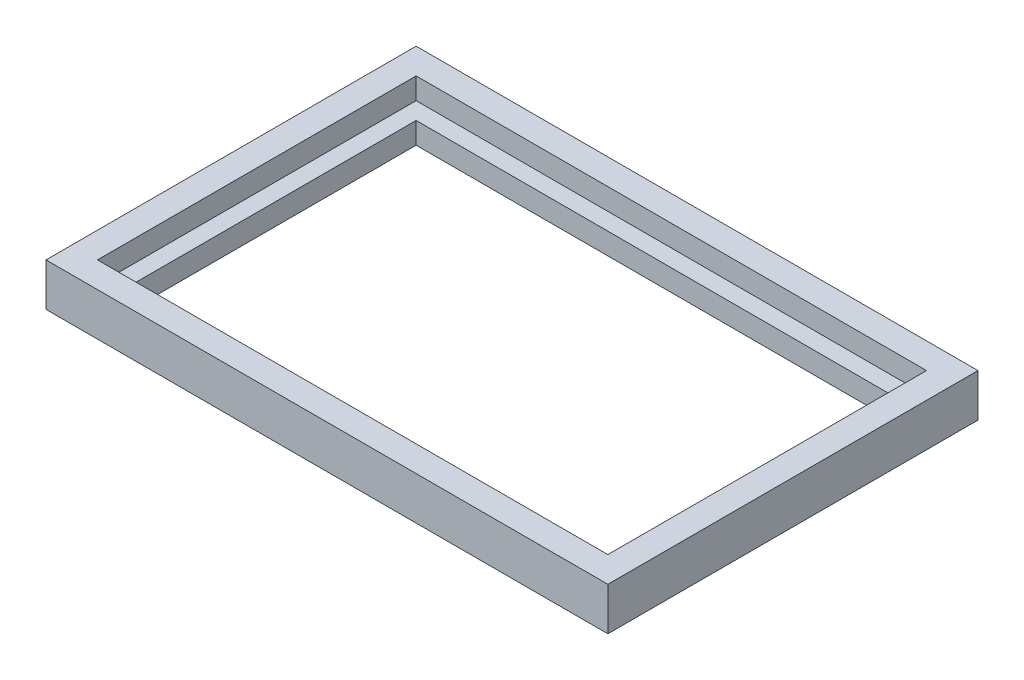
ISO-10303-21;
HEADER;
FILE_DESCRIPTION(('STEP AP214'),'2;1');
FILE_NAME('part.step','',(''),(''),'','','');
FILE_SCHEMA(('AUTOMOTIVE_DESIGN { 1 0 10303 214 1 1 1 1 }'));
ENDSEC;
DATA;
#1=APPLICATION_CONTEXT('core data for automotive mechanical design processes');
#2=APPLICATION_PROTOCOL_DEFINITION('international standard','automotive_design',2000,#1);
#3=PRODUCT_CONTEXT('',#1,'mechanical');
#4=PRODUCT('Part','Part','',(#3));
#5=PRODUCT_RELATED_PRODUCT_CATEGORY('part','',(#4));
#6=PRODUCT_DEFINITION_FORMATION('','',#4);
#7=PRODUCT_DEFINITION_CONTEXT('part definition',#1,'design');
#8=PRODUCT_DEFINITION('design','',#6,#7);
#9=PRODUCT_DEFINITION_SHAPE('','',#8);
#10=(LENGTH_UNIT() NAMED_UNIT(*) SI_UNIT(.MILLI.,.METRE.));
#11=(NAMED_UNIT(*) PLANE_ANGLE_UNIT() SI_UNIT($,.RADIAN.));
#12=(NAMED_UNIT(*) SI_UNIT($,.STERADIAN.) SOLID_ANGLE_UNIT());
#13=UNCERTAINTY_MEASURE_WITH_UNIT(LENGTH_MEASURE(1.E-05),#10,'distance_accuracy_value','');
#14=(GEOMETRIC_REPRESENTATION_CONTEXT(3) GLOBAL_UNCERTAINTY_ASSIGNED_CONTEXT((#13)) GLOBAL_UNIT_ASSIGNED_CONTEXT((#10,
#11,#12)) REPRESENTATION_CONTEXT('',''));
#15=CARTESIAN_POINT('',(0.,0.,0.));
#16=DIRECTION('',(0.,0.,1.));
#17=DIRECTION('',(1.,0.,0.));
#18=AXIS2_PLACEMENT_3D('',#15,#16,#17);
#19=CARTESIAN_POINT('',(-23.2906654675505,2.5,47.135438217786));
#20=DIRECTION('',(0.,0.,1.));
#21=DIRECTION('',(1.,0.,0.));
#22=AXIS2_PLACEMENT_3D('',#19,#20,#21);
#23=PLANE('',#22);
#24=DIRECTION('',(1.,0.,0.));
#25=VECTOR('',#24,1.);
#26=CARTESIAN_POINT('',(-23.2906654675505,5.,47.135438217786));
#27=LINE('',#26,#25);
#28=CARTESIAN_POINT('',(-23.2906654675506,5.,47.135438217786));
#29=VERTEX_POINT('',#28);
#30=CARTESIAN_POINT('',(36.2093345324495,5.,47.135438217786));
#31=VERTEX_POINT('',#30);
#32=EDGE_CURVE('E184',#29,#31,#27,.T.);
#33=ORIENTED_EDGE('',*,*,#32,.T.);
#34=DIRECTION('',(0.,1.,0.));
#35=VECTOR('',#34,1.);
#36=CARTESIAN_POINT('',(36.2093345324495,2.5,47.135438217786));
#37=LINE('',#36,#35);
#38=CARTESIAN_POINT('',(36.2093345324495,2.5,47.135438217786));
#39=VERTEX_POINT('',#38);
#40=EDGE_CURVE('E193',#39,#31,#37,.T.);
#41=ORIENTED_EDGE('',*,*,#40,.F.);
#42=DIRECTION('',(1.,0.,0.));
#43=VECTOR('',#42,1.);
#44=CARTESIAN_POINT('',(-23.2906654675505,2.5,47.135438217786));
#45=LINE('',#44,#43);
#46=CARTESIAN_POINT('',(-23.2906654675505,2.5,47.135438217786));
#47=VERTEX_POINT('',#46);
#48=EDGE_CURVE('E159',#47,#39,#45,.T.);
#49=ORIENTED_EDGE('',*,*,#48,.F.);
#50=DIRECTION('',(0.,1.,0.));
#51=VECTOR('',#50,1.);
#52=CARTESIAN_POINT('',(-23.2906654675505,2.5,47.135438217786));
#53=LINE('',#52,#51);
#54=EDGE_CURVE('E188',#47,#29,#53,.T.);
#55=ORIENTED_EDGE('',*,*,#54,.T.);
#56=EDGE_LOOP('',(#33,#41,#49,#55));
#57=FACE_BOUND('',#56,.T.);
#58=ADVANCED_FACE('F41',(#57),#23,.F.);
#59=CARTESIAN_POINT('',(36.2093345324495,2.5,9.985438217786));
#60=DIRECTION('',(1.,0.,0.));
#61=DIRECTION('',(0.,0.,-1.));
#62=AXIS2_PLACEMENT_3D('',#59,#60,#61);
#63=PLANE('',#62);
#64=DIRECTION('',(0.,0.,-1.));
#65=VECTOR('',#64,1.);
#66=CARTESIAN_POINT('',(36.2093345324495,5.,9.985438217786));
#67=LINE('',#66,#65);
#68=CARTESIAN_POINT('',(36.2093345324495,5.,9.985438217786));
#69=VERTEX_POINT('',#68);
#70=EDGE_CURVE('E189',#31,#69,#67,.T.);
#71=ORIENTED_EDGE('',*,*,#70,.T.);
#72=DIRECTION('',(0.,1.,0.));
#73=VECTOR('',#72,1.);
#74=CARTESIAN_POINT('',(36.2093345324495,2.5,9.985438217786));
#75=LINE('',#74,#73);
#76=CARTESIAN_POINT('',(36.2093345324495,2.5,9.985438217786));
#77=VERTEX_POINT('',#76);
#78=EDGE_CURVE('E183',#77,#69,#75,.T.);
#79=ORIENTED_EDGE('',*,*,#78,.F.);
#80=DIRECTION('',(0.,0.,-1.));
#81=VECTOR('',#80,1.);
#82=CARTESIAN_POINT('',(36.2093345324495,2.5,9.985438217786));
#83=LINE('',#82,#81);
#84=EDGE_CURVE('E171',#39,#77,#83,.T.);
#85=ORIENTED_EDGE('',*,*,#84,.F.);
#86=ORIENTED_EDGE('',*,*,#40,.T.);
#87=EDGE_LOOP('',(#71,#79,#85,#86));
#88=FACE_BOUND('',#87,.T.);
#89=ADVANCED_FACE('F273',(#88),#63,.F.);
#90=CARTESIAN_POINT('',(-23.2906654675506,2.5,9.985438217786));
#91=DIRECTION('',(0.,0.,-1.));
#92=DIRECTION('',(-1.,0.,0.));
#93=AXIS2_PLACEMENT_3D('',#90,#91,#92);
#94=PLANE('',#93);
#95=DIRECTION('',(-1.,0.,0.));
#96=VECTOR('',#95,1.);
#97=CARTESIAN_POINT('',(-23.2906654675506,5.,9.985438217786));
#98=LINE('',#97,#96);
#99=CARTESIAN_POINT('',(-23.2906654675506,5.,9.985438217786));
#100=VERTEX_POINT('',#99);
#101=EDGE_CURVE('E194',#69,#100,#98,.T.);
#102=ORIENTED_EDGE('',*,*,#101,.T.);
#103=DIRECTION('',(0.,1.,0.));
#104=VECTOR('',#103,1.);
#105=CARTESIAN_POINT('',(-23.2906654675506,2.5,9.985438217786));
#106=LINE('',#105,#104);
#107=CARTESIAN_POINT('',(-23.2906654675506,2.5,9.985438217786));
#108=VERTEX_POINT('',#107);
#109=EDGE_CURVE('E148',#108,#100,#106,.T.);
#110=ORIENTED_EDGE('',*,*,#109,.F.);
#111=DIRECTION('',(-1.,0.,0.));
#112=VECTOR('',#111,1.);
#113=CARTESIAN_POINT('',(-23.2906654675506,2.5,9.985438217786));
#114=LINE('',#113,#112);
#115=EDGE_CURVE('E175',#77,#108,#114,.T.);
#116=ORIENTED_EDGE('',*,*,#115,.F.);
#117=ORIENTED_EDGE('',*,*,#78,.T.);
#118=EDGE_LOOP('',(#102,#110,#116,#117));
#119=FACE_BOUND('',#118,.T.);
#120=ADVANCED_FACE('F280',(#119),#94,.F.);
#121=CARTESIAN_POINT('',(-23.2906654675506,2.5,9.985438217786));
#122=DIRECTION('',(-1.,0.,0.));
#123=DIRECTION('',(0.,0.,1.));
#124=AXIS2_PLACEMENT_3D('',#121,#122,#123);
#125=PLANE('',#124);
#126=DIRECTION('',(0.,0.,1.));
#127=VECTOR('',#126,1.);
#128=CARTESIAN_POINT('',(-23.2906654675506,5.,9.985438217786));
#129=LINE('',#128,#127);
#130=EDGE_CURVE('E180',#100,#29,#129,.T.);
#131=ORIENTED_EDGE('',*,*,#130,.T.);
#132=ORIENTED_EDGE('',*,*,#54,.F.);
#133=DIRECTION('',(0.,0.,1.));
#134=VECTOR('',#133,1.);
#135=CARTESIAN_POINT('',(-23.2906654675506,2.5,9.985438217786));
#136=LINE('',#135,#134);
#137=EDGE_CURVE('E154',#108,#47,#136,.T.);
#138=ORIENTED_EDGE('',*,*,#137,.F.);
#139=ORIENTED_EDGE('',*,*,#109,.T.);
#140=EDGE_LOOP('',(#131,#132,#138,#139));
#141=FACE_BOUND('',#140,.T.);
#142=ADVANCED_FACE('F284',(#141),#125,.F.);
#143=CARTESIAN_POINT('',(40.,5.,-12.5));
#144=DIRECTION('',(0.,1.,0.));
#145=DIRECTION('',(0.,0.,1.));
#146=AXIS2_PLACEMENT_3D('',#143,#144,#145);
#147=PLANE('',#146);
#148=ORIENTED_EDGE('',*,*,#130,.F.);
#149=ORIENTED_EDGE('',*,*,#101,.F.);
#150=ORIENTED_EDGE('',*,*,#70,.F.);
#151=ORIENTED_EDGE('',*,*,#32,.F.);
#152=EDGE_LOOP('',(#148,#149,#150,#151));
#153=FACE_BOUND('',#152,.T.);
#154=DIRECTION('',(-1.,0.,0.));
#155=VECTOR('',#154,1.);
#156=CARTESIAN_POINT('',(-26.2906654675505,5.,6.98543821778599));
#157=LINE('',#156,#155);
#158=CARTESIAN_POINT('',(39.2093345324495,5.,6.98543821778599));
#159=VERTEX_POINT('',#158);
#160=CARTESIAN_POINT('',(-26.2906654675505,5.,6.98543821778599));
#161=VERTEX_POINT('',#160);
#162=EDGE_CURVE('E142',#159,#161,#157,.T.);
#163=ORIENTED_EDGE('',*,*,#162,.T.);
#164=DIRECTION('',(0.,0.,1.));
#165=VECTOR('',#164,1.);
#166=CARTESIAN_POINT('',(-26.2906654675505,5.,6.98543821778599));
#167=LINE('',#166,#165);
#168=CARTESIAN_POINT('',(-26.2906654675505,5.,50.135438217786));
#169=VERTEX_POINT('',#168);
#170=EDGE_CURVE('E45',#161,#169,#167,.T.);
#171=ORIENTED_EDGE('',*,*,#170,.T.);
#172=DIRECTION('',(1.,0.,0.));
#173=VECTOR('',#172,1.);
#174=CARTESIAN_POINT('',(-26.2906654675505,5.,50.135438217786));
#175=LINE('',#174,#173);
#176=CARTESIAN_POINT('',(39.2093345324495,5.,50.135438217786));
#177=VERTEX_POINT('',#176);
#178=EDGE_CURVE('E152',#169,#177,#175,.T.);
#179=ORIENTED_EDGE('',*,*,#178,.T.);
#180=DIRECTION('',(0.,0.,-1.));
#181=VECTOR('',#180,1.);
#182=CARTESIAN_POINT('',(39.2093345324495,5.,6.98543821778599));
#183=LINE('',#182,#181);
#184=EDGE_CURVE('E128',#177,#159,#183,.T.);
#185=ORIENTED_EDGE('',*,*,#184,.T.);
#186=EDGE_LOOP('',(#163,#171,#179,#185));
#187=FACE_BOUND('',#186,.T.);
#188=ADVANCED_FACE('F151',(#153,#187),#147,.T.);
#189=CARTESIAN_POINT('',(0.,2.5,0.));
#190=DIRECTION('',(0.,1.,0.));
#191=DIRECTION('',(0.,0.,1.));
#192=AXIS2_PLACEMENT_3D('',#189,#190,#191);
#193=PLANE('',#192);
#194=ORIENTED_EDGE('',*,*,#137,.T.);
#195=ORIENTED_EDGE('',*,*,#48,.T.);
#196=ORIENTED_EDGE('',*,*,#84,.T.);
#197=ORIENTED_EDGE('',*,*,#115,.T.);
#198=EDGE_LOOP('',(#194,#195,#196,#197));
#199=FACE_BOUND('',#198,.T.);
#200=DIRECTION('',(0.,0.,-1.));
#201=VECTOR('',#200,1.);
#202=CARTESIAN_POINT('',(-21.2906654675505,2.5,45.135438217786));
#203=LINE('',#202,#201);
#204=CARTESIAN_POINT('',(-21.2906654675505,2.5,45.135438217786));
#205=VERTEX_POINT('',#204);
#206=CARTESIAN_POINT('',(-21.2906654675505,2.5,11.985438217786));
#207=VERTEX_POINT('',#206);
#208=EDGE_CURVE('E179',#205,#207,#203,.T.);
#209=ORIENTED_EDGE('',*,*,#208,.T.);
#210=DIRECTION('',(1.,0.,0.));
#211=VECTOR('',#210,1.);
#212=CARTESIAN_POINT('',(-21.2906654675505,2.5,11.985438217786));
#213=LINE('',#212,#211);
#214=CARTESIAN_POINT('',(34.2093345324495,2.5,11.985438217786));
#215=VERTEX_POINT('',#214);
#216=EDGE_CURVE('E211',#207,#215,#213,.T.);
#217=ORIENTED_EDGE('',*,*,#216,.T.);
#218=DIRECTION('',(0.,0.,1.));
#219=VECTOR('',#218,1.);
#220=CARTESIAN_POINT('',(34.2093345324495,2.5,45.135438217786));
#221=LINE('',#220,#219);
#222=CARTESIAN_POINT('',(34.2093345324495,2.5,45.135438217786));
#223=VERTEX_POINT('',#222);
#224=EDGE_CURVE('E207',#215,#223,#221,.T.);
#225=ORIENTED_EDGE('',*,*,#224,.T.);
#226=DIRECTION('',(-1.,0.,0.));
#227=VECTOR('',#226,1.);
#228=CARTESIAN_POINT('',(-21.2906654675505,2.5,45.135438217786));
#229=LINE('',#228,#227);
#230=EDGE_CURVE('E210',#223,#205,#229,.T.);
#231=ORIENTED_EDGE('',*,*,#230,.T.);
#232=EDGE_LOOP('',(#209,#217,#225,#231));
#233=FACE_BOUND('',#232,.T.);
#234=ADVANCED_FACE('F290',(#199,#233),#193,.T.);
#235=CARTESIAN_POINT('',(34.2093345324495,10.,45.135438217786));
#236=DIRECTION('',(1.,0.,0.));
#237=DIRECTION('',(0.,0.,-1.));
#238=AXIS2_PLACEMENT_3D('',#235,#236,#237);
#239=PLANE('',#238);
#240=ORIENTED_EDGE('',*,*,#224,.F.);
#241=DIRECTION('',(0.,-1.,0.));
#242=VECTOR('',#241,1.);
#243=CARTESIAN_POINT('',(34.2093345324495,10.,11.985438217786));
#244=LINE('',#243,#242);
#245=CARTESIAN_POINT('',(34.2093345324495,0.,11.985438217786));
#246=VERTEX_POINT('',#245);
#247=EDGE_CURVE('E214',#215,#246,#244,.T.);
#248=ORIENTED_EDGE('',*,*,#247,.T.);
#249=DIRECTION('',(0.,0.,1.));
#250=VECTOR('',#249,1.);
#251=CARTESIAN_POINT('',(34.2093345324495,0.,45.135438217786));
#252=LINE('',#251,#250);
#253=CARTESIAN_POINT('',(34.2093345324495,0.,45.135438217786));
#254=VERTEX_POINT('',#253);
#255=EDGE_CURVE('E227',#246,#254,#252,.T.);
#256=ORIENTED_EDGE('',*,*,#255,.T.);
#257=DIRECTION('',(0.,-1.,0.));
#258=VECTOR('',#257,1.);
#259=CARTESIAN_POINT('',(34.2093345324495,10.,45.135438217786));
#260=LINE('',#259,#258);
#261=EDGE_CURVE('E231',#223,#254,#260,.T.);
#262=ORIENTED_EDGE('',*,*,#261,.F.);
#263=EDGE_LOOP('',(#240,#248,#256,#262));
#264=FACE_BOUND('',#263,.T.);
#265=ADVANCED_FACE('F292',(#264),#239,.F.);
#266=CARTESIAN_POINT('',(-21.2906654675505,10.,45.135438217786));
#267=DIRECTION('',(0.,0.,1.));
#268=DIRECTION('',(1.,0.,0.));
#269=AXIS2_PLACEMENT_3D('',#266,#267,#268);
#270=PLANE('',#269);
#271=ORIENTED_EDGE('',*,*,#230,.F.);
#272=ORIENTED_EDGE('',*,*,#261,.T.);
#273=DIRECTION('',(-1.,0.,0.));
#274=VECTOR('',#273,1.);
#275=CARTESIAN_POINT('',(-21.2906654675505,0.,45.135438217786));
#276=LINE('',#275,#274);
#277=CARTESIAN_POINT('',(-21.2906654675505,0.,45.135438217786));
#278=VERTEX_POINT('',#277);
#279=EDGE_CURVE('E232',#254,#278,#276,.T.);
#280=ORIENTED_EDGE('',*,*,#279,.T.);
#281=DIRECTION('',(0.,-1.,0.));
#282=VECTOR('',#281,1.);
#283=CARTESIAN_POINT('',(-21.2906654675505,10.,45.135438217786));
#284=LINE('',#283,#282);
#285=EDGE_CURVE('E222',#205,#278,#284,.T.);
#286=ORIENTED_EDGE('',*,*,#285,.F.);
#287=EDGE_LOOP('',(#271,#272,#280,#286));
#288=FACE_BOUND('',#287,.T.);
#289=ADVANCED_FACE('F330',(#288),#270,.F.);
#290=CARTESIAN_POINT('',(-21.2906654675505,10.,45.135438217786));
#291=DIRECTION('',(-1.,0.,0.));
#292=DIRECTION('',(0.,0.,1.));
#293=AXIS2_PLACEMENT_3D('',#290,#291,#292);
#294=PLANE('',#293);
#295=ORIENTED_EDGE('',*,*,#208,.F.);
#296=ORIENTED_EDGE('',*,*,#285,.T.);
#297=DIRECTION('',(0.,0.,-1.));
#298=VECTOR('',#297,1.);
#299=CARTESIAN_POINT('',(-21.2906654675505,0.,45.135438217786));
#300=LINE('',#299,#298);
#301=CARTESIAN_POINT('',(-21.2906654675505,0.,11.985438217786));
#302=VERTEX_POINT('',#301);
#303=EDGE_CURVE('E217',#278,#302,#300,.T.);
#304=ORIENTED_EDGE('',*,*,#303,.T.);
#305=DIRECTION('',(0.,-1.,0.));
#306=VECTOR('',#305,1.);
#307=CARTESIAN_POINT('',(-21.2906654675505,10.,11.985438217786));
#308=LINE('',#307,#306);
#309=EDGE_CURVE('E221',#207,#302,#308,.T.);
#310=ORIENTED_EDGE('',*,*,#309,.F.);
#311=EDGE_LOOP('',(#295,#296,#304,#310));
#312=FACE_BOUND('',#311,.T.);
#313=ADVANCED_FACE('F320',(#312),#294,.F.);
#314=CARTESIAN_POINT('',(-21.2906654675505,10.,11.985438217786));
#315=DIRECTION('',(0.,0.,-1.));
#316=DIRECTION('',(-1.,0.,0.));
#317=AXIS2_PLACEMENT_3D('',#314,#315,#316);
#318=PLANE('',#317);
#319=ORIENTED_EDGE('',*,*,#216,.F.);
#320=ORIENTED_EDGE('',*,*,#309,.T.);
#321=DIRECTION('',(1.,0.,0.));
#322=VECTOR('',#321,1.);
#323=CARTESIAN_POINT('',(-21.2906654675505,0.,11.985438217786));
#324=LINE('',#323,#322);
#325=EDGE_CURVE('E223',#302,#246,#324,.T.);
#326=ORIENTED_EDGE('',*,*,#325,.T.);
#327=ORIENTED_EDGE('',*,*,#247,.F.);
#328=EDGE_LOOP('',(#319,#320,#326,#327));
#329=FACE_BOUND('',#328,.T.);
#330=ADVANCED_FACE('F268',(#329),#318,.F.);
#331=CARTESIAN_POINT('',(40.,0.,-12.5));
#332=DIRECTION('',(0.,1.,0.));
#333=DIRECTION('',(0.,0.,1.));
#334=AXIS2_PLACEMENT_3D('',#331,#332,#333);
#335=PLANE('',#334);
#336=ORIENTED_EDGE('',*,*,#325,.F.);
#337=ORIENTED_EDGE('',*,*,#303,.F.);
#338=ORIENTED_EDGE('',*,*,#279,.F.);
#339=ORIENTED_EDGE('',*,*,#255,.F.);
#340=EDGE_LOOP('',(#336,#337,#338,#339));
#341=FACE_BOUND('',#340,.T.);
#342=DIRECTION('',(0.,0.,1.));
#343=VECTOR('',#342,1.);
#344=CARTESIAN_POINT('',(-26.2906654675506,0.,-12.5));
#345=LINE('',#344,#343);
#346=CARTESIAN_POINT('',(-26.2906654675505,0.,6.98543821778599));
#347=VERTEX_POINT('',#346);
#348=CARTESIAN_POINT('',(-26.2906654675505,0.,50.135438217786));
#349=VERTEX_POINT('',#348);
#350=EDGE_CURVE('E52',#347,#349,#345,.T.);
#351=ORIENTED_EDGE('',*,*,#350,.F.);
#352=DIRECTION('',(-1.,0.,0.));
#353=VECTOR('',#352,1.);
#354=CARTESIAN_POINT('',(40.,0.,6.98543821778599));
#355=LINE('',#354,#353);
#356=CARTESIAN_POINT('',(39.2093345324495,0.,6.98543821778599));
#357=VERTEX_POINT('',#356);
#358=EDGE_CURVE('E139',#357,#347,#355,.T.);
#359=ORIENTED_EDGE('',*,*,#358,.F.);
#360=DIRECTION('',(0.,0.,-1.));
#361=VECTOR('',#360,1.);
#362=CARTESIAN_POINT('',(39.2093345324495,0.,-12.5));
#363=LINE('',#362,#361);
#364=CARTESIAN_POINT('',(39.2093345324495,0.,50.135438217786));
#365=VERTEX_POINT('',#364);
#366=EDGE_CURVE('E135',#365,#357,#363,.T.);
#367=ORIENTED_EDGE('',*,*,#366,.F.);
#368=DIRECTION('',(1.,0.,0.));
#369=VECTOR('',#368,1.);
#370=CARTESIAN_POINT('',(40.,0.,50.135438217786));
#371=LINE('',#370,#369);
#372=EDGE_CURVE('E166',#349,#365,#371,.T.);
#373=ORIENTED_EDGE('',*,*,#372,.F.);
#374=EDGE_LOOP('',(#351,#359,#367,#373));
#375=FACE_BOUND('',#374,.T.);
#376=ADVANCED_FACE('F257',(#341,#375),#335,.F.);
#377=CARTESIAN_POINT('',(-26.2906654675505,-5.,50.135438217786));
#378=DIRECTION('',(0.,0.,1.));
#379=DIRECTION('',(1.,0.,0.));
#380=AXIS2_PLACEMENT_3D('',#377,#378,#379);
#381=PLANE('',#380);
#382=ORIENTED_EDGE('',*,*,#372,.T.);
#383=DIRECTION('',(0.,1.,0.));
#384=VECTOR('',#383,1.);
#385=CARTESIAN_POINT('',(39.2093345324495,-5.,50.135438217786));
#386=LINE('',#385,#384);
#387=EDGE_CURVE('E164',#365,#177,#386,.T.);
#388=ORIENTED_EDGE('',*,*,#387,.T.);
#389=ORIENTED_EDGE('',*,*,#178,.F.);
#390=DIRECTION('',(0.,1.,0.));
#391=VECTOR('',#390,1.);
#392=CARTESIAN_POINT('',(-26.2906654675505,-5.,50.135438217786));
#393=LINE('',#392,#391);
#394=EDGE_CURVE('E12',#349,#169,#393,.T.);
#395=ORIENTED_EDGE('',*,*,#394,.F.);
#396=EDGE_LOOP('',(#382,#388,#389,#395));
#397=FACE_BOUND('',#396,.T.);
#398=ADVANCED_FACE('F259',(#397),#381,.T.);
#399=CARTESIAN_POINT('',(39.2093345324495,-5.,6.98543821778599));
#400=DIRECTION('',(1.,0.,0.));
#401=DIRECTION('',(0.,0.,-1.));
#402=AXIS2_PLACEMENT_3D('',#399,#400,#401);
#403=PLANE('',#402);
#404=ORIENTED_EDGE('',*,*,#366,.T.);
#405=DIRECTION('',(0.,1.,0.));
#406=VECTOR('',#405,1.);
#407=CARTESIAN_POINT('',(39.2093345324495,-5.,6.98543821778599));
#408=LINE('',#407,#406);
#409=EDGE_CURVE('E131',#357,#159,#408,.T.);
#410=ORIENTED_EDGE('',*,*,#409,.T.);
#411=ORIENTED_EDGE('',*,*,#184,.F.);
#412=ORIENTED_EDGE('',*,*,#387,.F.);
#413=EDGE_LOOP('',(#404,#410,#411,#412));
#414=FACE_BOUND('',#413,.T.);
#415=ADVANCED_FACE('F133',(#414),#403,.T.);
#416=CARTESIAN_POINT('',(-26.2906654675505,-5.,6.98543821778599));
#417=DIRECTION('',(0.,0.,-1.));
#418=DIRECTION('',(-1.,0.,0.));
#419=AXIS2_PLACEMENT_3D('',#416,#417,#418);
#420=PLANE('',#419);
#421=ORIENTED_EDGE('',*,*,#358,.T.);
#422=DIRECTION('',(0.,1.,0.));
#423=VECTOR('',#422,1.);
#424=CARTESIAN_POINT('',(-26.2906654675505,-5.,6.98543821778599));
#425=LINE('',#424,#423);
#426=EDGE_CURVE('E144',#347,#161,#425,.T.);
#427=ORIENTED_EDGE('',*,*,#426,.T.);
#428=ORIENTED_EDGE('',*,*,#162,.F.);
#429=ORIENTED_EDGE('',*,*,#409,.F.);
#430=EDGE_LOOP('',(#421,#427,#428,#429));
#431=FACE_BOUND('',#430,.T.);
#432=ADVANCED_FACE('F43',(#431),#420,.T.);
#433=CARTESIAN_POINT('',(-26.2906654675505,-5.,6.98543821778599));
#434=DIRECTION('',(-1.,0.,0.));
#435=DIRECTION('',(0.,0.,1.));
#436=AXIS2_PLACEMENT_3D('',#433,#434,#435);
#437=PLANE('',#436);
#438=ORIENTED_EDGE('',*,*,#350,.T.);
#439=ORIENTED_EDGE('',*,*,#394,.T.);
#440=ORIENTED_EDGE('',*,*,#170,.F.);
#441=ORIENTED_EDGE('',*,*,#426,.F.);
#442=EDGE_LOOP('',(#438,#439,#440,#441));
#443=FACE_BOUND('',#442,.T.);
#444=ADVANCED_FACE('F255',(#443),#437,.T.);
#445=CLOSED_SHELL('',(#58,#89,#120,#142,#188,#234,#265,#289,#313,#330,#376,#398,#415,#432,#444));
#446=MANIFOLD_SOLID_BREP('B2',#445);
#447=ADVANCED_BREP_SHAPE_REPRESENTATION('',(#18,#446),#14);
#448=SHAPE_DEFINITION_REPRESENTATION(#9,#447);
ENDSEC;
END-ISO-10303-21;
